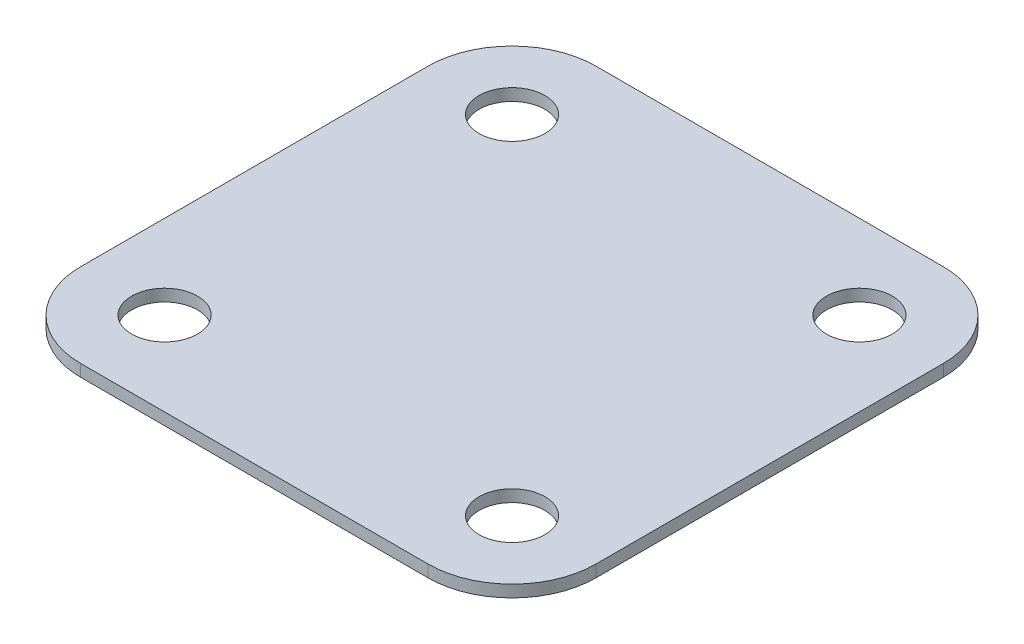
ISO-10303-21;
HEADER;
FILE_DESCRIPTION(('STEP AP214'),'2;1');
FILE_NAME('part.step','',(''),(''),'','','');
FILE_SCHEMA(('AUTOMOTIVE_DESIGN { 1 0 10303 214 1 1 1 1 }'));
ENDSEC;
DATA;
#1=APPLICATION_CONTEXT('core data for automotive mechanical design processes');
#2=APPLICATION_PROTOCOL_DEFINITION('international standard','automotive_design',2000,#1);
#3=PRODUCT_CONTEXT('',#1,'mechanical');
#4=PRODUCT('Part','Part','',(#3));
#5=PRODUCT_RELATED_PRODUCT_CATEGORY('part','',(#4));
#6=PRODUCT_DEFINITION_FORMATION('','',#4);
#7=PRODUCT_DEFINITION_CONTEXT('part definition',#1,'design');
#8=PRODUCT_DEFINITION('design','',#6,#7);
#9=PRODUCT_DEFINITION_SHAPE('','',#8);
#10=(LENGTH_UNIT() NAMED_UNIT(*) SI_UNIT(.MILLI.,.METRE.));
#11=(NAMED_UNIT(*) PLANE_ANGLE_UNIT() SI_UNIT($,.RADIAN.));
#12=(NAMED_UNIT(*) SI_UNIT($,.STERADIAN.) SOLID_ANGLE_UNIT());
#13=UNCERTAINTY_MEASURE_WITH_UNIT(LENGTH_MEASURE(1.E-05),#10,'distance_accuracy_value','');
#14=(GEOMETRIC_REPRESENTATION_CONTEXT(3) GLOBAL_UNCERTAINTY_ASSIGNED_CONTEXT((#13)) GLOBAL_UNIT_ASSIGNED_CONTEXT((#10,
#11,#12)) REPRESENTATION_CONTEXT('',''));
#15=CARTESIAN_POINT('',(0.,0.,0.));
#16=DIRECTION('',(0.,0.,1.));
#17=DIRECTION('',(1.,0.,0.));
#18=AXIS2_PLACEMENT_3D('',#15,#16,#17);
#19=CARTESIAN_POINT('',(43.,2.,-43.));
#20=DIRECTION('',(-1.,0.,0.));
#21=DIRECTION('',(0.,0.,1.));
#22=AXIS2_PLACEMENT_3D('',#19,#20,#21);
#23=PLANE('',#22);
#24=DIRECTION('',(0.,0.,-1.));
#25=VECTOR('',#24,1.);
#26=CARTESIAN_POINT('',(43.,2.,-43.));
#27=LINE('',#26,#25);
#28=CARTESIAN_POINT('',(43.,2.,29.));
#29=VERTEX_POINT('',#28);
#30=CARTESIAN_POINT('',(43.,2.,-29.));
#31=VERTEX_POINT('',#30);
#32=EDGE_CURVE('E135',#29,#31,#27,.T.);
#33=ORIENTED_EDGE('',*,*,#32,.F.);
#34=DIRECTION('',(0.,-1.,0.));
#35=VECTOR('',#34,1.);
#36=CARTESIAN_POINT('',(43.,2.,29.));
#37=LINE('',#36,#35);
#38=CARTESIAN_POINT('',(43.,0.,29.));
#39=VERTEX_POINT('',#38);
#40=EDGE_CURVE('E174',#29,#39,#37,.T.);
#41=ORIENTED_EDGE('',*,*,#40,.T.);
#42=DIRECTION('',(0.,0.,-1.));
#43=VECTOR('',#42,1.);
#44=CARTESIAN_POINT('',(43.,0.,-43.));
#45=LINE('',#44,#43);
#46=CARTESIAN_POINT('',(43.,0.,-29.));
#47=VERTEX_POINT('',#46);
#48=EDGE_CURVE('E189',#39,#47,#45,.T.);
#49=ORIENTED_EDGE('',*,*,#48,.T.);
#50=DIRECTION('',(0.,-1.,0.));
#51=VECTOR('',#50,1.);
#52=CARTESIAN_POINT('',(43.,2.,-29.));
#53=LINE('',#52,#51);
#54=EDGE_CURVE('E171',#47,#31,#53,.F.);
#55=ORIENTED_EDGE('',*,*,#54,.T.);
#56=EDGE_LOOP('',(#33,#41,#49,#55));
#57=FACE_BOUND('',#56,.T.);
#58=ADVANCED_FACE('F39',(#57),#23,.F.);
#59=CARTESIAN_POINT('',(-43.,2.,-43.));
#60=DIRECTION('',(0.,0.,1.));
#61=DIRECTION('',(1.,0.,0.));
#62=AXIS2_PLACEMENT_3D('',#59,#60,#61);
#63=PLANE('',#62);
#64=DIRECTION('',(-1.,0.,0.));
#65=VECTOR('',#64,1.);
#66=CARTESIAN_POINT('',(-43.,2.,-43.));
#67=LINE('',#66,#65);
#68=CARTESIAN_POINT('',(29.,2.,-43.));
#69=VERTEX_POINT('',#68);
#70=CARTESIAN_POINT('',(-29.,2.,-43.));
#71=VERTEX_POINT('',#70);
#72=EDGE_CURVE('E140',#69,#71,#67,.T.);
#73=ORIENTED_EDGE('',*,*,#72,.F.);
#74=DIRECTION('',(0.,-1.,0.));
#75=VECTOR('',#74,1.);
#76=CARTESIAN_POINT('',(29.,2.,-43.));
#77=LINE('',#76,#75);
#78=CARTESIAN_POINT('',(29.,0.,-43.));
#79=VERTEX_POINT('',#78);
#80=EDGE_CURVE('E11',#69,#79,#77,.T.);
#81=ORIENTED_EDGE('',*,*,#80,.T.);
#82=DIRECTION('',(-1.,0.,0.));
#83=VECTOR('',#82,1.);
#84=CARTESIAN_POINT('',(-43.,0.,-43.));
#85=LINE('',#84,#83);
#86=CARTESIAN_POINT('',(-29.,0.,-43.));
#87=VERTEX_POINT('',#86);
#88=EDGE_CURVE('E142',#79,#87,#85,.T.);
#89=ORIENTED_EDGE('',*,*,#88,.T.);
#90=DIRECTION('',(0.,-1.,0.));
#91=VECTOR('',#90,1.);
#92=CARTESIAN_POINT('',(-29.,2.,-43.));
#93=LINE('',#92,#91);
#94=EDGE_CURVE('E48',#87,#71,#93,.F.);
#95=ORIENTED_EDGE('',*,*,#94,.T.);
#96=EDGE_LOOP('',(#73,#81,#89,#95));
#97=FACE_BOUND('',#96,.T.);
#98=ADVANCED_FACE('F195',(#97),#63,.F.);
#99=CARTESIAN_POINT('',(-43.,2.,-43.));
#100=DIRECTION('',(1.,0.,0.));
#101=DIRECTION('',(0.,0.,-1.));
#102=AXIS2_PLACEMENT_3D('',#99,#100,#101);
#103=PLANE('',#102);
#104=DIRECTION('',(0.,0.,1.));
#105=VECTOR('',#104,1.);
#106=CARTESIAN_POINT('',(-43.,0.,-43.));
#107=LINE('',#106,#105);
#108=CARTESIAN_POINT('',(-43.,0.,-29.));
#109=VERTEX_POINT('',#108);
#110=CARTESIAN_POINT('',(-43.,0.,29.));
#111=VERTEX_POINT('',#110);
#112=EDGE_CURVE('E136',#109,#111,#107,.T.);
#113=ORIENTED_EDGE('',*,*,#112,.T.);
#114=DIRECTION('',(0.,-1.,0.));
#115=VECTOR('',#114,1.);
#116=CARTESIAN_POINT('',(-43.,2.,29.));
#117=LINE('',#116,#115);
#118=CARTESIAN_POINT('',(-43.,2.,29.));
#119=VERTEX_POINT('',#118);
#120=EDGE_CURVE('E111',#111,#119,#117,.F.);
#121=ORIENTED_EDGE('',*,*,#120,.T.);
#122=DIRECTION('',(0.,0.,1.));
#123=VECTOR('',#122,1.);
#124=CARTESIAN_POINT('',(-43.,2.,-43.));
#125=LINE('',#124,#123);
#126=CARTESIAN_POINT('',(-43.,2.,-29.));
#127=VERTEX_POINT('',#126);
#128=EDGE_CURVE('E180',#127,#119,#125,.T.);
#129=ORIENTED_EDGE('',*,*,#128,.F.);
#130=DIRECTION('',(0.,-1.,0.));
#131=VECTOR('',#130,1.);
#132=CARTESIAN_POINT('',(-43.,2.,-29.));
#133=LINE('',#132,#131);
#134=EDGE_CURVE('E117',#127,#109,#133,.T.);
#135=ORIENTED_EDGE('',*,*,#134,.T.);
#136=EDGE_LOOP('',(#113,#121,#129,#135));
#137=FACE_BOUND('',#136,.T.);
#138=ADVANCED_FACE('F202',(#137),#103,.F.);
#139=CARTESIAN_POINT('',(-43.,2.,43.));
#140=DIRECTION('',(0.,0.,-1.));
#141=DIRECTION('',(-1.,0.,0.));
#142=AXIS2_PLACEMENT_3D('',#139,#140,#141);
#143=PLANE('',#142);
#144=DIRECTION('',(1.,0.,0.));
#145=VECTOR('',#144,1.);
#146=CARTESIAN_POINT('',(-43.,2.,43.));
#147=LINE('',#146,#145);
#148=CARTESIAN_POINT('',(-29.,2.,43.));
#149=VERTEX_POINT('',#148);
#150=CARTESIAN_POINT('',(29.,2.,43.));
#151=VERTEX_POINT('',#150);
#152=EDGE_CURVE('E127',#149,#151,#147,.T.);
#153=ORIENTED_EDGE('',*,*,#152,.F.);
#154=DIRECTION('',(0.,-1.,0.));
#155=VECTOR('',#154,1.);
#156=CARTESIAN_POINT('',(-29.,2.,43.));
#157=LINE('',#156,#155);
#158=CARTESIAN_POINT('',(-29.,0.,43.));
#159=VERTEX_POINT('',#158);
#160=EDGE_CURVE('E110',#149,#159,#157,.T.);
#161=ORIENTED_EDGE('',*,*,#160,.T.);
#162=DIRECTION('',(1.,0.,0.));
#163=VECTOR('',#162,1.);
#164=CARTESIAN_POINT('',(-43.,0.,43.));
#165=LINE('',#164,#163);
#166=CARTESIAN_POINT('',(29.,0.,43.));
#167=VERTEX_POINT('',#166);
#168=EDGE_CURVE('E124',#159,#167,#165,.T.);
#169=ORIENTED_EDGE('',*,*,#168,.T.);
#170=DIRECTION('',(0.,-1.,0.));
#171=VECTOR('',#170,1.);
#172=CARTESIAN_POINT('',(29.,2.,43.));
#173=LINE('',#172,#171);
#174=EDGE_CURVE('E130',#167,#151,#173,.F.);
#175=ORIENTED_EDGE('',*,*,#174,.T.);
#176=EDGE_LOOP('',(#153,#161,#169,#175));
#177=FACE_BOUND('',#176,.T.);
#178=ADVANCED_FACE('F123',(#177),#143,.F.);
#179=CARTESIAN_POINT('',(0.,2.,0.));
#180=DIRECTION('',(0.,1.,0.));
#181=DIRECTION('',(0.,0.,1.));
#182=AXIS2_PLACEMENT_3D('',#179,#180,#181);
#183=PLANE('',#182);
#184=CARTESIAN_POINT('',(29.,2.,-29.));
#185=DIRECTION('',(0.,1.,0.));
#186=DIRECTION('',(0.,0.,1.));
#187=AXIS2_PLACEMENT_3D('',#184,#185,#186);
#188=CIRCLE('',#187,5.5);
#189=CARTESIAN_POINT('',(29.,2.,-23.5));
#190=VERTEX_POINT('',#189);
#191=EDGE_CURVE('E192',#190,#190,#188,.T.);
#192=ORIENTED_EDGE('',*,*,#191,.F.);
#193=EDGE_LOOP('',(#192));
#194=FACE_BOUND('',#193,.T.);
#195=CARTESIAN_POINT('',(29.,2.,29.));
#196=DIRECTION('',(0.,1.,0.));
#197=DIRECTION('',(0.,0.,1.));
#198=AXIS2_PLACEMENT_3D('',#195,#196,#197);
#199=CIRCLE('',#198,5.5);
#200=CARTESIAN_POINT('',(29.,2.,34.5));
#201=VERTEX_POINT('',#200);
#202=EDGE_CURVE('E287',#201,#201,#199,.T.);
#203=ORIENTED_EDGE('',*,*,#202,.F.);
#204=EDGE_LOOP('',(#203));
#205=FACE_BOUND('',#204,.T.);
#206=CARTESIAN_POINT('',(-29.,2.,29.));
#207=DIRECTION('',(0.,1.,0.));
#208=DIRECTION('',(0.,0.,1.));
#209=AXIS2_PLACEMENT_3D('',#206,#207,#208);
#210=CIRCLE('',#209,5.5);
#211=CARTESIAN_POINT('',(-29.,2.,34.5));
#212=VERTEX_POINT('',#211);
#213=EDGE_CURVE('E278',#212,#212,#210,.T.);
#214=ORIENTED_EDGE('',*,*,#213,.F.);
#215=EDGE_LOOP('',(#214));
#216=FACE_BOUND('',#215,.T.);
#217=CARTESIAN_POINT('',(-29.,2.,-29.));
#218=DIRECTION('',(0.,1.,0.));
#219=DIRECTION('',(0.,0.,1.));
#220=AXIS2_PLACEMENT_3D('',#217,#218,#219);
#221=CIRCLE('',#220,5.5);
#222=CARTESIAN_POINT('',(-29.,2.,-23.5));
#223=VERTEX_POINT('',#222);
#224=EDGE_CURVE('E274',#223,#223,#221,.T.);
#225=ORIENTED_EDGE('',*,*,#224,.F.);
#226=EDGE_LOOP('',(#225));
#227=FACE_BOUND('',#226,.T.);
#228=ORIENTED_EDGE('',*,*,#128,.T.);
#229=CARTESIAN_POINT('',(-29.,2.,29.));
#230=DIRECTION('',(0.,1.,0.));
#231=DIRECTION('',(0.,0.,1.));
#232=AXIS2_PLACEMENT_3D('',#229,#230,#231);
#233=CIRCLE('',#232,14.);
#234=EDGE_CURVE('E168',#119,#149,#233,.T.);
#235=ORIENTED_EDGE('',*,*,#234,.T.);
#236=ORIENTED_EDGE('',*,*,#152,.T.);
#237=CARTESIAN_POINT('',(29.,2.,29.));
#238=DIRECTION('',(0.,1.,0.));
#239=DIRECTION('',(0.,0.,1.));
#240=AXIS2_PLACEMENT_3D('',#237,#238,#239);
#241=CIRCLE('',#240,14.);
#242=EDGE_CURVE('E165',#151,#29,#241,.T.);
#243=ORIENTED_EDGE('',*,*,#242,.T.);
#244=ORIENTED_EDGE('',*,*,#32,.T.);
#245=CARTESIAN_POINT('',(29.,2.,-29.));
#246=DIRECTION('',(0.,1.,0.));
#247=DIRECTION('',(0.,0.,1.));
#248=AXIS2_PLACEMENT_3D('',#245,#246,#247);
#249=CIRCLE('',#248,14.);
#250=EDGE_CURVE('E61',#31,#69,#249,.T.);
#251=ORIENTED_EDGE('',*,*,#250,.T.);
#252=ORIENTED_EDGE('',*,*,#72,.T.);
#253=CARTESIAN_POINT('',(-29.,2.,-29.));
#254=DIRECTION('',(0.,1.,0.));
#255=DIRECTION('',(0.,0.,1.));
#256=AXIS2_PLACEMENT_3D('',#253,#254,#255);
#257=CIRCLE('',#256,14.);
#258=EDGE_CURVE('E160',#71,#127,#257,.T.);
#259=ORIENTED_EDGE('',*,*,#258,.T.);
#260=EDGE_LOOP('',(#228,#235,#236,#243,#244,#251,#252,#259));
#261=FACE_BOUND('',#260,.T.);
#262=ADVANCED_FACE('F200',(#194,#205,#216,#227,#261),#183,.T.);
#263=CARTESIAN_POINT('',(0.,0.,0.));
#264=DIRECTION('',(0.,1.,0.));
#265=DIRECTION('',(0.,0.,1.));
#266=AXIS2_PLACEMENT_3D('',#263,#264,#265);
#267=PLANE('',#266);
#268=CARTESIAN_POINT('',(29.,0.,-29.));
#269=DIRECTION('',(0.,1.,0.));
#270=DIRECTION('',(0.,0.,1.));
#271=AXIS2_PLACEMENT_3D('',#268,#269,#270);
#272=CIRCLE('',#271,5.5);
#273=CARTESIAN_POINT('',(29.,0.,-23.5));
#274=VERTEX_POINT('',#273);
#275=EDGE_CURVE('E261',#274,#274,#272,.T.);
#276=ORIENTED_EDGE('',*,*,#275,.T.);
#277=EDGE_LOOP('',(#276));
#278=FACE_BOUND('',#277,.T.);
#279=CARTESIAN_POINT('',(29.,0.,29.));
#280=DIRECTION('',(0.,1.,0.));
#281=DIRECTION('',(0.,0.,1.));
#282=AXIS2_PLACEMENT_3D('',#279,#280,#281);
#283=CIRCLE('',#282,5.5);
#284=CARTESIAN_POINT('',(29.,0.,34.5));
#285=VERTEX_POINT('',#284);
#286=EDGE_CURVE('E265',#285,#285,#283,.T.);
#287=ORIENTED_EDGE('',*,*,#286,.T.);
#288=EDGE_LOOP('',(#287));
#289=FACE_BOUND('',#288,.T.);
#290=CARTESIAN_POINT('',(-29.,0.,29.));
#291=DIRECTION('',(0.,1.,0.));
#292=DIRECTION('',(0.,0.,1.));
#293=AXIS2_PLACEMENT_3D('',#290,#291,#292);
#294=CIRCLE('',#293,5.5);
#295=CARTESIAN_POINT('',(-29.,0.,34.5));
#296=VERTEX_POINT('',#295);
#297=EDGE_CURVE('E269',#296,#296,#294,.T.);
#298=ORIENTED_EDGE('',*,*,#297,.T.);
#299=EDGE_LOOP('',(#298));
#300=FACE_BOUND('',#299,.T.);
#301=CARTESIAN_POINT('',(-29.,0.,-29.));
#302=DIRECTION('',(0.,1.,0.));
#303=DIRECTION('',(0.,0.,1.));
#304=AXIS2_PLACEMENT_3D('',#301,#302,#303);
#305=CIRCLE('',#304,5.5);
#306=CARTESIAN_POINT('',(-29.,0.,-23.5));
#307=VERTEX_POINT('',#306);
#308=EDGE_CURVE('E272',#307,#307,#305,.T.);
#309=ORIENTED_EDGE('',*,*,#308,.T.);
#310=EDGE_LOOP('',(#309));
#311=FACE_BOUND('',#310,.T.);
#312=ORIENTED_EDGE('',*,*,#168,.F.);
#313=CARTESIAN_POINT('',(-29.,0.,29.));
#314=DIRECTION('',(0.,1.,0.));
#315=DIRECTION('',(0.,0.,1.));
#316=AXIS2_PLACEMENT_3D('',#313,#314,#315);
#317=CIRCLE('',#316,14.);
#318=EDGE_CURVE('E106',#159,#111,#317,.F.);
#319=ORIENTED_EDGE('',*,*,#318,.T.);
#320=ORIENTED_EDGE('',*,*,#112,.F.);
#321=CARTESIAN_POINT('',(-29.,0.,-29.));
#322=DIRECTION('',(0.,1.,0.));
#323=DIRECTION('',(0.,0.,1.));
#324=AXIS2_PLACEMENT_3D('',#321,#322,#323);
#325=CIRCLE('',#324,14.);
#326=EDGE_CURVE('E129',#109,#87,#325,.F.);
#327=ORIENTED_EDGE('',*,*,#326,.T.);
#328=ORIENTED_EDGE('',*,*,#88,.F.);
#329=CARTESIAN_POINT('',(29.,0.,-29.));
#330=DIRECTION('',(0.,1.,0.));
#331=DIRECTION('',(0.,0.,1.));
#332=AXIS2_PLACEMENT_3D('',#329,#330,#331);
#333=CIRCLE('',#332,14.);
#334=EDGE_CURVE('E150',#79,#47,#333,.F.);
#335=ORIENTED_EDGE('',*,*,#334,.T.);
#336=ORIENTED_EDGE('',*,*,#48,.F.);
#337=CARTESIAN_POINT('',(29.,0.,29.));
#338=DIRECTION('',(0.,1.,0.));
#339=DIRECTION('',(0.,0.,1.));
#340=AXIS2_PLACEMENT_3D('',#337,#338,#339);
#341=CIRCLE('',#340,14.);
#342=EDGE_CURVE('E118',#39,#167,#341,.F.);
#343=ORIENTED_EDGE('',*,*,#342,.T.);
#344=EDGE_LOOP('',(#312,#319,#320,#327,#328,#335,#336,#343));
#345=FACE_BOUND('',#344,.T.);
#346=ADVANCED_FACE('F132',(#278,#289,#300,#311,#345),#267,.F.);
#347=CARTESIAN_POINT('',(-29.,2.,29.));
#348=DIRECTION('',(0.,-1.,0.));
#349=DIRECTION('',(0.,0.,-1.));
#350=AXIS2_PLACEMENT_3D('',#347,#348,#349);
#351=CYLINDRICAL_SURFACE('',#350,14.);
#352=ORIENTED_EDGE('',*,*,#234,.F.);
#353=ORIENTED_EDGE('',*,*,#120,.F.);
#354=ORIENTED_EDGE('',*,*,#318,.F.);
#355=ORIENTED_EDGE('',*,*,#160,.F.);
#356=EDGE_LOOP('',(#352,#353,#354,#355));
#357=FACE_BOUND('',#356,.T.);
#358=ADVANCED_FACE('F109',(#357),#351,.T.);
#359=CARTESIAN_POINT('',(29.,2.,29.));
#360=DIRECTION('',(0.,-1.,0.));
#361=DIRECTION('',(0.,0.,-1.));
#362=AXIS2_PLACEMENT_3D('',#359,#360,#361);
#363=CYLINDRICAL_SURFACE('',#362,14.);
#364=ORIENTED_EDGE('',*,*,#242,.F.);
#365=ORIENTED_EDGE('',*,*,#174,.F.);
#366=ORIENTED_EDGE('',*,*,#342,.F.);
#367=ORIENTED_EDGE('',*,*,#40,.F.);
#368=EDGE_LOOP('',(#364,#365,#366,#367));
#369=FACE_BOUND('',#368,.T.);
#370=ADVANCED_FACE('F220',(#369),#363,.T.);
#371=CARTESIAN_POINT('',(29.,2.,-29.));
#372=DIRECTION('',(0.,-1.,0.));
#373=DIRECTION('',(0.,0.,-1.));
#374=AXIS2_PLACEMENT_3D('',#371,#372,#373);
#375=CYLINDRICAL_SURFACE('',#374,14.);
#376=ORIENTED_EDGE('',*,*,#250,.F.);
#377=ORIENTED_EDGE('',*,*,#54,.F.);
#378=ORIENTED_EDGE('',*,*,#334,.F.);
#379=ORIENTED_EDGE('',*,*,#80,.F.);
#380=EDGE_LOOP('',(#376,#377,#378,#379));
#381=FACE_BOUND('',#380,.T.);
#382=ADVANCED_FACE('F222',(#381),#375,.T.);
#383=CARTESIAN_POINT('',(-29.,2.,-29.));
#384=DIRECTION('',(0.,-1.,0.));
#385=DIRECTION('',(0.,0.,-1.));
#386=AXIS2_PLACEMENT_3D('',#383,#384,#385);
#387=CYLINDRICAL_SURFACE('',#386,14.);
#388=ORIENTED_EDGE('',*,*,#258,.F.);
#389=ORIENTED_EDGE('',*,*,#94,.F.);
#390=ORIENTED_EDGE('',*,*,#326,.F.);
#391=ORIENTED_EDGE('',*,*,#134,.F.);
#392=EDGE_LOOP('',(#388,#389,#390,#391));
#393=FACE_BOUND('',#392,.T.);
#394=ADVANCED_FACE('F41',(#393),#387,.T.);
#395=CARTESIAN_POINT('',(-29.,0.,-29.));
#396=DIRECTION('',(0.,1.,0.));
#397=DIRECTION('',(0.,0.,1.));
#398=AXIS2_PLACEMENT_3D('',#395,#396,#397);
#399=CYLINDRICAL_SURFACE('',#398,5.5);
#400=ORIENTED_EDGE('',*,*,#224,.T.);
#401=EDGE_LOOP('',(#400));
#402=FACE_BOUND('',#401,.T.);
#403=ORIENTED_EDGE('',*,*,#308,.F.);
#404=EDGE_LOOP('',(#403));
#405=FACE_BOUND('',#404,.T.);
#406=ADVANCED_FACE('F229',(#402,#405),#399,.F.);
#407=CARTESIAN_POINT('',(-29.,0.,29.));
#408=DIRECTION('',(0.,1.,0.));
#409=DIRECTION('',(0.,0.,1.));
#410=AXIS2_PLACEMENT_3D('',#407,#408,#409);
#411=CYLINDRICAL_SURFACE('',#410,5.5);
#412=ORIENTED_EDGE('',*,*,#213,.T.);
#413=EDGE_LOOP('',(#412));
#414=FACE_BOUND('',#413,.T.);
#415=ORIENTED_EDGE('',*,*,#297,.F.);
#416=EDGE_LOOP('',(#415));
#417=FACE_BOUND('',#416,.T.);
#418=ADVANCED_FACE('F236',(#414,#417),#411,.F.);
#419=CARTESIAN_POINT('',(29.,0.,29.));
#420=DIRECTION('',(0.,1.,0.));
#421=DIRECTION('',(0.,0.,1.));
#422=AXIS2_PLACEMENT_3D('',#419,#420,#421);
#423=CYLINDRICAL_SURFACE('',#422,5.5);
#424=ORIENTED_EDGE('',*,*,#202,.T.);
#425=EDGE_LOOP('',(#424));
#426=FACE_BOUND('',#425,.T.);
#427=ORIENTED_EDGE('',*,*,#286,.F.);
#428=EDGE_LOOP('',(#427));
#429=FACE_BOUND('',#428,.T.);
#430=ADVANCED_FACE('F242',(#426,#429),#423,.F.);
#431=CARTESIAN_POINT('',(29.,0.,-29.));
#432=DIRECTION('',(0.,1.,0.));
#433=DIRECTION('',(0.,0.,1.));
#434=AXIS2_PLACEMENT_3D('',#431,#432,#433);
#435=CYLINDRICAL_SURFACE('',#434,5.5);
#436=ORIENTED_EDGE('',*,*,#191,.T.);
#437=EDGE_LOOP('',(#436));
#438=FACE_BOUND('',#437,.T.);
#439=ORIENTED_EDGE('',*,*,#275,.F.);
#440=EDGE_LOOP('',(#439));
#441=FACE_BOUND('',#440,.T.);
#442=ADVANCED_FACE('F249',(#438,#441),#435,.F.);
#443=CLOSED_SHELL('',(#58,#98,#138,#178,#262,#346,#358,#370,#382,#394,#406,#418,#430,#442));
#444=MANIFOLD_SOLID_BREP('B2',#443);
#445=ADVANCED_BREP_SHAPE_REPRESENTATION('',(#18,#444),#14);
#446=SHAPE_DEFINITION_REPRESENTATION(#9,#445);
ENDSEC;
END-ISO-10303-21;
